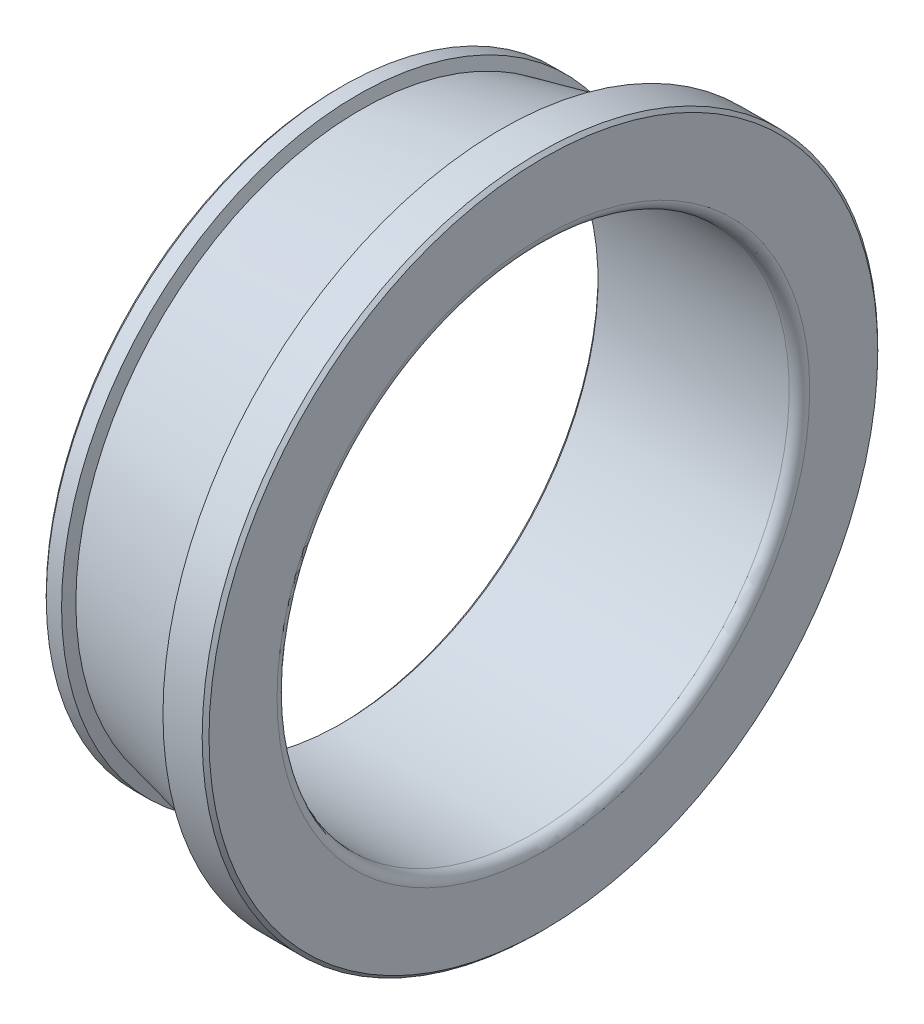
ISO-10303-21;
HEADER;
FILE_DESCRIPTION(('STEP AP214'),'2;1');
FILE_NAME('part.step','',(''),(''),'','','');
FILE_SCHEMA(('AUTOMOTIVE_DESIGN { 1 0 10303 214 1 1 1 1 }'));
ENDSEC;
DATA;
#1=APPLICATION_CONTEXT('core data for automotive mechanical design processes');
#2=APPLICATION_PROTOCOL_DEFINITION('international standard','automotive_design',2000,#1);
#3=PRODUCT_CONTEXT('',#1,'mechanical');
#4=PRODUCT('Part','Part','',(#3));
#5=PRODUCT_RELATED_PRODUCT_CATEGORY('part','',(#4));
#6=PRODUCT_DEFINITION_FORMATION('','',#4);
#7=PRODUCT_DEFINITION_CONTEXT('part definition',#1,'design');
#8=PRODUCT_DEFINITION('design','',#6,#7);
#9=PRODUCT_DEFINITION_SHAPE('','',#8);
#10=(LENGTH_UNIT() NAMED_UNIT(*) SI_UNIT(.MILLI.,.METRE.));
#11=(NAMED_UNIT(*) PLANE_ANGLE_UNIT() SI_UNIT($,.RADIAN.));
#12=(NAMED_UNIT(*) SI_UNIT($,.STERADIAN.) SOLID_ANGLE_UNIT());
#13=UNCERTAINTY_MEASURE_WITH_UNIT(LENGTH_MEASURE(1.E-05),#10,'distance_accuracy_value','');
#14=(GEOMETRIC_REPRESENTATION_CONTEXT(3) GLOBAL_UNCERTAINTY_ASSIGNED_CONTEXT((#13)) GLOBAL_UNIT_ASSIGNED_CONTEXT((#10,
#11,#12)) REPRESENTATION_CONTEXT('',''));
#15=CARTESIAN_POINT('',(0.,0.,0.));
#16=DIRECTION('',(0.,0.,1.));
#17=DIRECTION('',(1.,0.,0.));
#18=AXIS2_PLACEMENT_3D('',#15,#16,#17);
#19=CARTESIAN_POINT('',(0.,-29.0596435615341,-28.529666666667));
#20=DIRECTION('',(-1.,0.,0.));
#21=DIRECTION('',(0.,0.,1.));
#22=AXIS2_PLACEMENT_3D('',#19,#20,#21);
#23=PLANE('',#22);
#24=CARTESIAN_POINT('',(0.,0.,0.));
#25=DIRECTION('',(-1.,0.,0.));
#26=DIRECTION('',(0.,0.,-1.));
#27=AXIS2_PLACEMENT_3D('',#24,#25,#26);
#28=CIRCLE('',#27,28.529666666667);
#29=CARTESIAN_POINT('',(0.,0.,-28.529666666667));
#30=VERTEX_POINT('',#29);
#31=EDGE_CURVE('E55',#30,#30,#28,.F.);
#32=ORIENTED_EDGE('',*,*,#31,.F.);
#33=EDGE_LOOP('',(#32));
#34=FACE_BOUND('',#33,.T.);
#35=CARTESIAN_POINT('',(0.,0.,0.));
#36=DIRECTION('',(1.,0.,0.));
#37=DIRECTION('',(0.,0.,1.));
#38=AXIS2_PLACEMENT_3D('',#35,#36,#37);
#39=CIRCLE('',#38,25.333333333333);
#40=CARTESIAN_POINT('',(0.,0.,25.333333333333));
#41=VERTEX_POINT('',#40);
#42=EDGE_CURVE('E52',#41,#41,#39,.T.);
#43=ORIENTED_EDGE('',*,*,#42,.T.);
#44=EDGE_LOOP('',(#43));
#45=FACE_BOUND('',#44,.T.);
#46=ADVANCED_FACE('F14',(#34,#45),#23,.T.);
#47=CARTESIAN_POINT('',(20.,-33.0033506390612,32.641666666667));
#48=DIRECTION('',(1.,0.,0.));
#49=DIRECTION('',(0.,0.,-1.));
#50=AXIS2_PLACEMENT_3D('',#47,#48,#49);
#51=PLANE('',#50);
#52=CARTESIAN_POINT('',(20.,0.,0.));
#53=DIRECTION('',(1.,0.,0.));
#54=DIRECTION('',(0.,-1.16842634282912E-09,1.));
#55=AXIS2_PLACEMENT_3D('',#52,#53,#54);
#56=CIRCLE('',#55,32.641666666667);
#57=CARTESIAN_POINT('',(20.,-3.81393832071808E-08,32.641666666667));
#58=VERTEX_POINT('',#57);
#59=EDGE_CURVE('E49',#58,#58,#56,.T.);
#60=ORIENTED_EDGE('',*,*,#59,.T.);
#61=EDGE_LOOP('',(#60));
#62=FACE_BOUND('',#61,.T.);
#63=CARTESIAN_POINT('',(20.,0.,0.));
#64=DIRECTION('',(-1.,0.,0.));
#65=DIRECTION('',(0.,0.,-1.));
#66=AXIS2_PLACEMENT_3D('',#63,#64,#65);
#67=CIRCLE('',#66,26.);
#68=CARTESIAN_POINT('',(20.,0.,-26.));
#69=VERTEX_POINT('',#68);
#70=EDGE_CURVE('E46',#69,#69,#67,.F.);
#71=ORIENTED_EDGE('',*,*,#70,.F.);
#72=EDGE_LOOP('',(#71));
#73=FACE_BOUND('',#72,.T.);
#74=ADVANCED_FACE('F63',(#62,#73),#51,.T.);
#75=CARTESIAN_POINT('',(0.,0.,0.));
#76=DIRECTION('',(-1.,0.,0.));
#77=DIRECTION('',(0.,0.,-1.));
#78=AXIS2_PLACEMENT_3D('',#75,#76,#77);
#79=CONICAL_SURFACE('',#78,25.333333333333,0.785398163396954);
#80=ORIENTED_EDGE('',*,*,#42,.F.);
#81=EDGE_LOOP('',(#80));
#82=FACE_BOUND('',#81,.T.);
#83=CARTESIAN_POINT('',(0.333333333333334,0.,0.));
#84=DIRECTION('',(1.,0.,0.));
#85=DIRECTION('',(0.,0.,1.));
#86=AXIS2_PLACEMENT_3D('',#83,#84,#85);
#87=CIRCLE('',#86,25.);
#88=CARTESIAN_POINT('',(0.333333333333334,0.,25.));
#89=VERTEX_POINT('',#88);
#90=EDGE_CURVE('E43',#89,#89,#87,.T.);
#91=ORIENTED_EDGE('',*,*,#90,.T.);
#92=EDGE_LOOP('',(#91));
#93=FACE_BOUND('',#92,.T.);
#94=ADVANCED_FACE('F67',(#82,#93),#79,.F.);
#95=CARTESIAN_POINT('',(20.,0.,0.));
#96=DIRECTION('',(1.,0.,0.));
#97=DIRECTION('',(0.,0.,1.));
#98=AXIS2_PLACEMENT_3D('',#95,#96,#97);
#99=CYLINDRICAL_SURFACE('',#98,25.);
#100=CARTESIAN_POINT('',(19.,0.,0.));
#101=DIRECTION('',(1.,0.,0.));
#102=DIRECTION('',(0.,0.,1.));
#103=AXIS2_PLACEMENT_3D('',#100,#101,#102);
#104=CIRCLE('',#103,25.);
#105=CARTESIAN_POINT('',(19.,0.,25.));
#106=VERTEX_POINT('',#105);
#107=EDGE_CURVE('E40',#106,#106,#104,.T.);
#108=ORIENTED_EDGE('',*,*,#107,.T.);
#109=EDGE_LOOP('',(#108));
#110=FACE_BOUND('',#109,.T.);
#111=ORIENTED_EDGE('',*,*,#90,.F.);
#112=EDGE_LOOP('',(#111));
#113=FACE_BOUND('',#112,.T.);
#114=ADVANCED_FACE('F70',(#110,#113),#99,.F.);
#115=CARTESIAN_POINT('',(19.0000000000015,0.,0.));
#116=DIRECTION('',(1.,0.,0.));
#117=DIRECTION('',(0.,0.,1.));
#118=AXIS2_PLACEMENT_3D('',#115,#116,#117);
#119=TOROIDAL_SURFACE('',#118,25.9999999999985,0.999999999998447);
#120=ORIENTED_EDGE('',*,*,#70,.T.);
#121=EDGE_LOOP('',(#120));
#122=FACE_BOUND('',#121,.T.);
#123=ORIENTED_EDGE('',*,*,#107,.F.);
#124=EDGE_LOOP('',(#123));
#125=FACE_BOUND('',#124,.T.);
#126=ADVANCED_FACE('F75',(#122,#125),#119,.T.);
#127=CARTESIAN_POINT('',(19.666666666667,0.,0.));
#128=DIRECTION('',(-1.,0.,0.));
#129=DIRECTION('',(0.,0.,-1.));
#130=AXIS2_PLACEMENT_3D('',#127,#128,#129);
#131=CONICAL_SURFACE('',#130,32.975,0.785398163397456);
#132=ORIENTED_EDGE('',*,*,#59,.F.);
#133=EDGE_LOOP('',(#132));
#134=FACE_BOUND('',#133,.T.);
#135=CARTESIAN_POINT('',(19.666666666667,0.,0.));
#136=DIRECTION('',(1.,0.,0.));
#137=DIRECTION('',(0.,0.,1.));
#138=AXIS2_PLACEMENT_3D('',#135,#136,#137);
#139=CIRCLE('',#138,32.975);
#140=CARTESIAN_POINT('',(19.666666666667,0.,32.975));
#141=VERTEX_POINT('',#140);
#142=EDGE_CURVE('E37',#141,#141,#139,.T.);
#143=ORIENTED_EDGE('',*,*,#142,.T.);
#144=EDGE_LOOP('',(#143));
#145=FACE_BOUND('',#144,.T.);
#146=ADVANCED_FACE('F82',(#134,#145),#131,.T.);
#147=CARTESIAN_POINT('',(20.,0.,0.));
#148=DIRECTION('',(1.,0.,0.));
#149=DIRECTION('',(0.,0.,1.));
#150=AXIS2_PLACEMENT_3D('',#147,#148,#149);
#151=CYLINDRICAL_SURFACE('',#150,32.975);
#152=CARTESIAN_POINT('',(15.838966508877,0.,0.));
#153=DIRECTION('',(1.,0.,0.));
#154=DIRECTION('',(0.,0.,1.));
#155=AXIS2_PLACEMENT_3D('',#152,#153,#154);
#156=CIRCLE('',#155,32.975);
#157=CARTESIAN_POINT('',(15.838966508877,0.,32.975));
#158=VERTEX_POINT('',#157);
#159=EDGE_CURVE('E34',#158,#158,#156,.T.);
#160=ORIENTED_EDGE('',*,*,#159,.T.);
#161=EDGE_LOOP('',(#160));
#162=FACE_BOUND('',#161,.T.);
#163=ORIENTED_EDGE('',*,*,#142,.F.);
#164=EDGE_LOOP('',(#163));
#165=FACE_BOUND('',#164,.T.);
#166=ADVANCED_FACE('F89',(#162,#165),#151,.T.);
#167=CARTESIAN_POINT('',(15.838966508877,0.,0.));
#168=DIRECTION('',(-1.,0.,0.));
#169=DIRECTION('',(0.,0.,-1.));
#170=AXIS2_PLACEMENT_3D('',#167,#168,#169);
#171=CONICAL_SURFACE('',#170,32.975,1.2959069696056);
#172=ORIENTED_EDGE('',*,*,#159,.F.);
#173=EDGE_LOOP('',(#172));
#174=FACE_BOUND('',#173,.T.);
#175=CARTESIAN_POINT('',(16.400117647268,0.,0.));
#176=DIRECTION('',(1.,0.,0.));
#177=DIRECTION('',(0.,0.,1.));
#178=AXIS2_PLACEMENT_3D('',#175,#176,#177);
#179=CIRCLE('',#178,30.985308147314);
#180=CARTESIAN_POINT('',(16.400117647268,0.,30.985308147314));
#181=VERTEX_POINT('',#180);
#182=EDGE_CURVE('E29',#181,#181,#179,.T.);
#183=ORIENTED_EDGE('',*,*,#182,.T.);
#184=EDGE_LOOP('',(#183));
#185=FACE_BOUND('',#184,.T.);
#186=ADVANCED_FACE('F93',(#174,#185),#171,.F.);
#187=CARTESIAN_POINT('',(16.400117647268,0.,0.));
#188=DIRECTION('',(1.,0.,0.));
#189=DIRECTION('',(0.,0.,1.));
#190=AXIS2_PLACEMENT_3D('',#187,#188,#189);
#191=CONICAL_SURFACE('',#190,30.985308147314,0.221360109030421);
#192=CARTESIAN_POINT('',(2.13593029707188,0.,0.));
#193=DIRECTION('',(1.,0.,0.));
#194=DIRECTION('',(0.,0.,1.));
#195=AXIS2_PLACEMENT_3D('',#192,#193,#194);
#196=CIRCLE('',#195,27.775181611341);
#197=CARTESIAN_POINT('',(2.13593029707188,0.,27.775181611341));
#198=VERTEX_POINT('',#197);
#199=EDGE_CURVE('E25',#198,#198,#196,.T.);
#200=ORIENTED_EDGE('',*,*,#199,.T.);
#201=EDGE_LOOP('',(#200));
#202=FACE_BOUND('',#201,.T.);
#203=ORIENTED_EDGE('',*,*,#182,.F.);
#204=EDGE_LOOP('',(#203));
#205=FACE_BOUND('',#204,.T.);
#206=ADVANCED_FACE('F97',(#202,#205),#191,.T.);
#207=CARTESIAN_POINT('',(1.8291337816546,0.,0.));
#208=DIRECTION('',(-1.,0.,0.));
#209=DIRECTION('',(0.,0.,-1.));
#210=AXIS2_PLACEMENT_3D('',#207,#208,#209);
#211=CONICAL_SURFACE('',#210,28.863,1.29590696960578);
#212=ORIENTED_EDGE('',*,*,#199,.F.);
#213=EDGE_LOOP('',(#212));
#214=FACE_BOUND('',#213,.T.);
#215=CARTESIAN_POINT('',(1.8291337816546,0.,0.));
#216=DIRECTION('',(1.,0.,0.));
#217=DIRECTION('',(0.,0.,1.));
#218=AXIS2_PLACEMENT_3D('',#215,#216,#217);
#219=CIRCLE('',#218,28.863);
#220=CARTESIAN_POINT('',(1.8291337816546,0.,28.863));
#221=VERTEX_POINT('',#220);
#222=EDGE_CURVE('E21',#221,#221,#219,.T.);
#223=ORIENTED_EDGE('',*,*,#222,.T.);
#224=EDGE_LOOP('',(#223));
#225=FACE_BOUND('',#224,.T.);
#226=ADVANCED_FACE('F101',(#214,#225),#211,.T.);
#227=CARTESIAN_POINT('',(20.,0.,0.));
#228=DIRECTION('',(1.,0.,0.));
#229=DIRECTION('',(0.,0.,1.));
#230=AXIS2_PLACEMENT_3D('',#227,#228,#229);
#231=CYLINDRICAL_SURFACE('',#230,28.863);
#232=CARTESIAN_POINT('',(0.333333333333332,0.,0.));
#233=DIRECTION('',(1.,0.,0.));
#234=DIRECTION('',(0.,0.,1.));
#235=AXIS2_PLACEMENT_3D('',#232,#233,#234);
#236=CIRCLE('',#235,28.863);
#237=CARTESIAN_POINT('',(0.333333333333332,0.,28.863));
#238=VERTEX_POINT('',#237);
#239=EDGE_CURVE('E10',#238,#238,#236,.T.);
#240=ORIENTED_EDGE('',*,*,#239,.T.);
#241=EDGE_LOOP('',(#240));
#242=FACE_BOUND('',#241,.T.);
#243=ORIENTED_EDGE('',*,*,#222,.F.);
#244=EDGE_LOOP('',(#243));
#245=FACE_BOUND('',#244,.T.);
#246=ADVANCED_FACE('F104',(#242,#245),#231,.T.);
#247=CARTESIAN_POINT('',(0.333333333333332,0.,0.));
#248=DIRECTION('',(1.,0.,0.));
#249=DIRECTION('',(0.,0.,1.));
#250=AXIS2_PLACEMENT_3D('',#247,#248,#249);
#251=CONICAL_SURFACE('',#250,28.863,0.785398163396949);
#252=ORIENTED_EDGE('',*,*,#31,.T.);
#253=EDGE_LOOP('',(#252));
#254=FACE_BOUND('',#253,.T.);
#255=ORIENTED_EDGE('',*,*,#239,.F.);
#256=EDGE_LOOP('',(#255));
#257=FACE_BOUND('',#256,.T.);
#258=ADVANCED_FACE('F16',(#254,#257),#251,.T.);
#259=CLOSED_SHELL('',(#46,#74,#94,#114,#126,#146,#166,#186,#206,#226,#246,#258));
#260=MANIFOLD_SOLID_BREP('B1',#259);
#261=ADVANCED_BREP_SHAPE_REPRESENTATION('',(#18,#260),#14);
#262=SHAPE_DEFINITION_REPRESENTATION(#9,#261);
ENDSEC;
END-ISO-10303-21;
